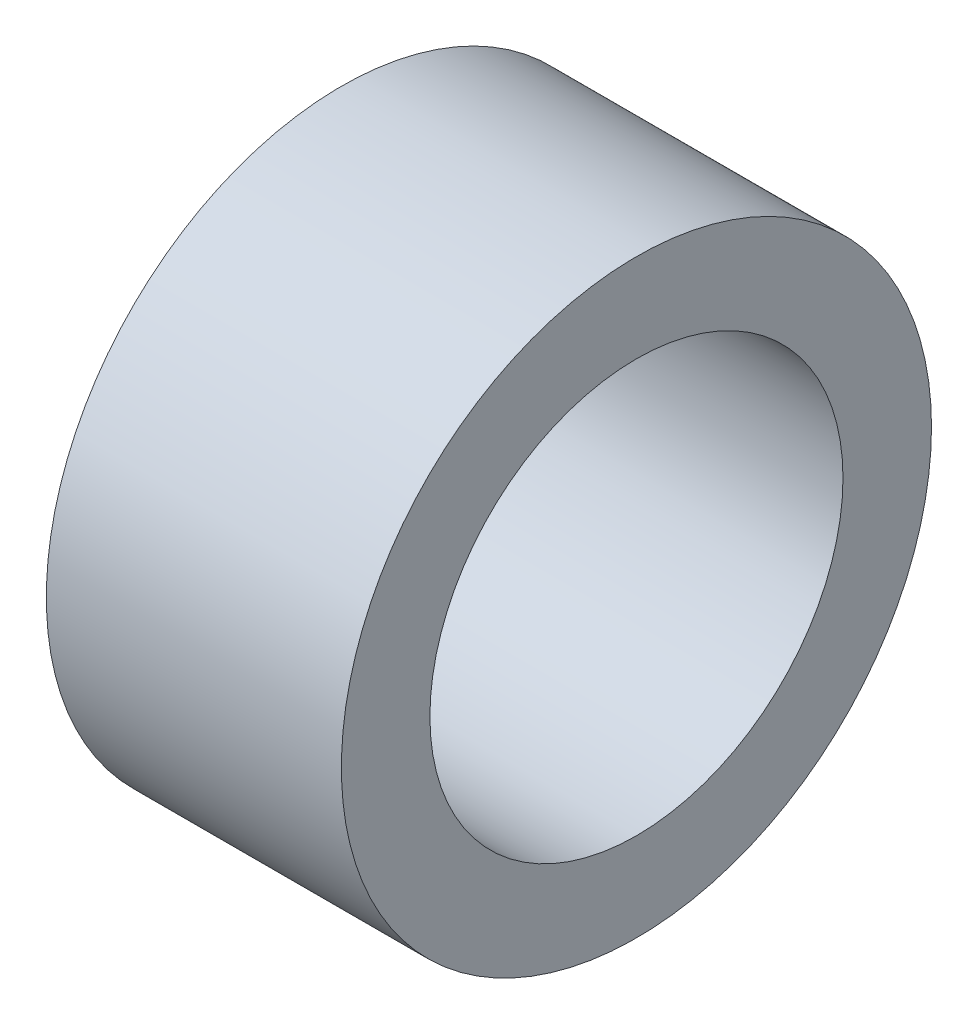
ISO-10303-21;
HEADER;
FILE_DESCRIPTION(('STEP AP214'),'2;1');
FILE_NAME('part.step','',(''),(''),'','','');
FILE_SCHEMA(('AUTOMOTIVE_DESIGN { 1 0 10303 214 1 1 1 1 }'));
ENDSEC;
DATA;
#1=APPLICATION_CONTEXT('core data for automotive mechanical design processes');
#2=APPLICATION_PROTOCOL_DEFINITION('international standard','automotive_design',2000,#1);
#3=PRODUCT_CONTEXT('',#1,'mechanical');
#4=PRODUCT('Part','Part','',(#3));
#5=PRODUCT_RELATED_PRODUCT_CATEGORY('part','',(#4));
#6=PRODUCT_DEFINITION_FORMATION('','',#4);
#7=PRODUCT_DEFINITION_CONTEXT('part definition',#1,'design');
#8=PRODUCT_DEFINITION('design','',#6,#7);
#9=PRODUCT_DEFINITION_SHAPE('','',#8);
#10=(LENGTH_UNIT() NAMED_UNIT(*) SI_UNIT(.MILLI.,.METRE.));
#11=(NAMED_UNIT(*) PLANE_ANGLE_UNIT() SI_UNIT($,.RADIAN.));
#12=(NAMED_UNIT(*) SI_UNIT($,.STERADIAN.) SOLID_ANGLE_UNIT());
#13=UNCERTAINTY_MEASURE_WITH_UNIT(LENGTH_MEASURE(1.E-05),#10,'distance_accuracy_value','');
#14=(GEOMETRIC_REPRESENTATION_CONTEXT(3) GLOBAL_UNCERTAINTY_ASSIGNED_CONTEXT((#13)) GLOBAL_UNIT_ASSIGNED_CONTEXT((#10,
#11,#12)) REPRESENTATION_CONTEXT('',''));
#15=CARTESIAN_POINT('',(0.,0.,0.));
#16=DIRECTION('',(0.,0.,1.));
#17=DIRECTION('',(1.,0.,0.));
#18=AXIS2_PLACEMENT_3D('',#15,#16,#17);
#19=CARTESIAN_POINT('',(5.,0.,0.));
#20=DIRECTION('',(1.,0.,0.));
#21=DIRECTION('',(0.,0.,-1.));
#22=AXIS2_PLACEMENT_3D('',#19,#20,#21);
#23=PLANE('',#22);
#24=CARTESIAN_POINT('',(5.,0.,0.));
#25=DIRECTION('',(1.,0.,0.));
#26=DIRECTION('',(0.,0.,-1.));
#27=AXIS2_PLACEMENT_3D('',#24,#25,#26);
#28=CIRCLE('',#27,5.);
#29=CARTESIAN_POINT('',(5.,0.,-5.));
#30=VERTEX_POINT('',#29);
#31=EDGE_CURVE('E10',#30,#30,#28,.T.);
#32=ORIENTED_EDGE('',*,*,#31,.T.);
#33=EDGE_LOOP('',(#32));
#34=FACE_BOUND('',#33,.T.);
#35=CARTESIAN_POINT('',(5.,0.,0.));
#36=DIRECTION('',(1.,0.,0.));
#37=DIRECTION('',(0.,0.,-1.));
#38=AXIS2_PLACEMENT_3D('',#35,#36,#37);
#39=CIRCLE('',#38,3.5);
#40=CARTESIAN_POINT('',(5.,0.,-3.5));
#41=VERTEX_POINT('',#40);
#42=EDGE_CURVE('E41',#41,#41,#39,.T.);
#43=ORIENTED_EDGE('',*,*,#42,.F.);
#44=EDGE_LOOP('',(#43));
#45=FACE_BOUND('',#44,.T.);
#46=ADVANCED_FACE('F30',(#34,#45),#23,.T.);
#47=CARTESIAN_POINT('',(0.,0.,0.));
#48=DIRECTION('',(1.,0.,0.));
#49=DIRECTION('',(0.,0.,-1.));
#50=AXIS2_PLACEMENT_3D('',#47,#48,#49);
#51=PLANE('',#50);
#52=CARTESIAN_POINT('',(0.,0.,0.));
#53=DIRECTION('',(1.,0.,0.));
#54=DIRECTION('',(0.,0.,-1.));
#55=AXIS2_PLACEMENT_3D('',#52,#53,#54);
#56=CIRCLE('',#55,5.);
#57=CARTESIAN_POINT('',(0.,0.,-5.));
#58=VERTEX_POINT('',#57);
#59=EDGE_CURVE('E34',#58,#58,#56,.T.);
#60=ORIENTED_EDGE('',*,*,#59,.F.);
#61=EDGE_LOOP('',(#60));
#62=FACE_BOUND('',#61,.T.);
#63=CARTESIAN_POINT('',(0.,0.,0.));
#64=DIRECTION('',(1.,0.,0.));
#65=DIRECTION('',(0.,0.,-1.));
#66=AXIS2_PLACEMENT_3D('',#63,#64,#65);
#67=CIRCLE('',#66,3.5);
#68=CARTESIAN_POINT('',(0.,0.,-3.5));
#69=VERTEX_POINT('',#68);
#70=EDGE_CURVE('E43',#69,#69,#67,.T.);
#71=ORIENTED_EDGE('',*,*,#70,.T.);
#72=EDGE_LOOP('',(#71));
#73=FACE_BOUND('',#72,.T.);
#74=ADVANCED_FACE('F53',(#62,#73),#51,.F.);
#75=CARTESIAN_POINT('',(5.,0.,0.));
#76=DIRECTION('',(-1.,0.,0.));
#77=DIRECTION('',(0.,0.,1.));
#78=AXIS2_PLACEMENT_3D('',#75,#76,#77);
#79=CYLINDRICAL_SURFACE('',#78,5.);
#80=ORIENTED_EDGE('',*,*,#31,.F.);
#81=EDGE_LOOP('',(#80));
#82=FACE_BOUND('',#81,.T.);
#83=ORIENTED_EDGE('',*,*,#59,.T.);
#84=EDGE_LOOP('',(#83));
#85=FACE_BOUND('',#84,.T.);
#86=ADVANCED_FACE('F32',(#82,#85),#79,.T.);
#87=CARTESIAN_POINT('',(5.,0.,0.));
#88=DIRECTION('',(-1.,0.,0.));
#89=DIRECTION('',(0.,0.,1.));
#90=AXIS2_PLACEMENT_3D('',#87,#88,#89);
#91=CYLINDRICAL_SURFACE('',#90,3.5);
#92=ORIENTED_EDGE('',*,*,#42,.T.);
#93=EDGE_LOOP('',(#92));
#94=FACE_BOUND('',#93,.T.);
#95=ORIENTED_EDGE('',*,*,#70,.F.);
#96=EDGE_LOOP('',(#95));
#97=FACE_BOUND('',#96,.T.);
#98=ADVANCED_FACE('F49',(#94,#97),#91,.F.);
#99=CLOSED_SHELL('',(#46,#74,#86,#98));
#100=MANIFOLD_SOLID_BREP('B2',#99);
#101=ADVANCED_BREP_SHAPE_REPRESENTATION('',(#18,#100),#14);
#102=SHAPE_DEFINITION_REPRESENTATION(#9,#101);
ENDSEC;
END-ISO-10303-21;
